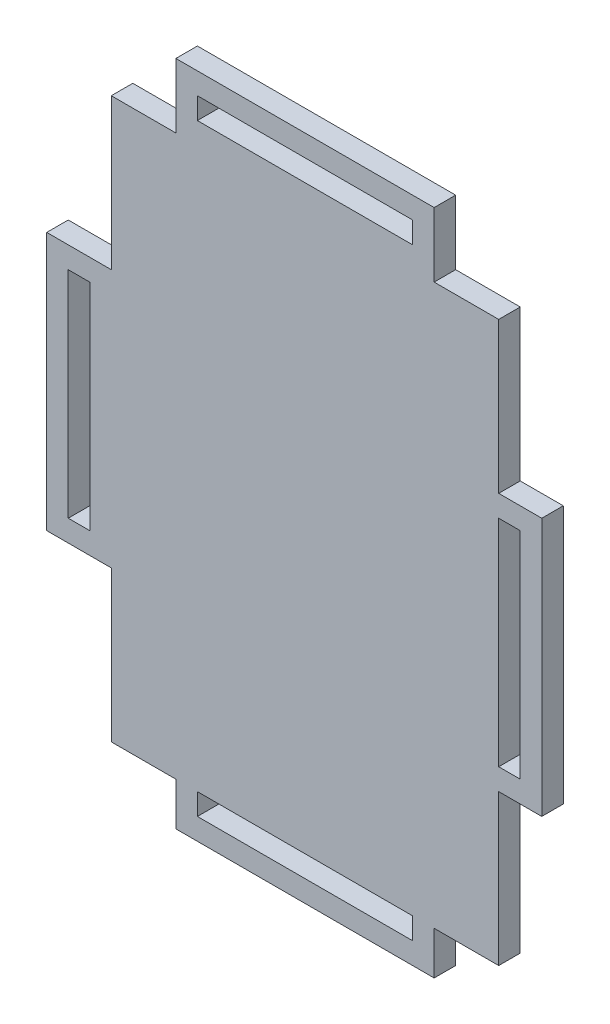
ISO-10303-21;
HEADER;
FILE_DESCRIPTION(('STEP AP214'),'2;1');
FILE_NAME('part.step','',(''),(''),'','','');
FILE_SCHEMA(('AUTOMOTIVE_DESIGN { 1 0 10303 214 1 1 1 1 }'));
ENDSEC;
DATA;
#1=APPLICATION_CONTEXT('core data for automotive mechanical design processes');
#2=APPLICATION_PROTOCOL_DEFINITION('international standard','automotive_design',2000,#1);
#3=PRODUCT_CONTEXT('',#1,'mechanical');
#4=PRODUCT('Part','Part','',(#3));
#5=PRODUCT_RELATED_PRODUCT_CATEGORY('part','',(#4));
#6=PRODUCT_DEFINITION_FORMATION('','',#4);
#7=PRODUCT_DEFINITION_CONTEXT('part definition',#1,'design');
#8=PRODUCT_DEFINITION('design','',#6,#7);
#9=PRODUCT_DEFINITION_SHAPE('','',#8);
#10=(LENGTH_UNIT() NAMED_UNIT(*) SI_UNIT(.MILLI.,.METRE.));
#11=(NAMED_UNIT(*) PLANE_ANGLE_UNIT() SI_UNIT($,.RADIAN.));
#12=(NAMED_UNIT(*) SI_UNIT($,.STERADIAN.) SOLID_ANGLE_UNIT());
#13=UNCERTAINTY_MEASURE_WITH_UNIT(LENGTH_MEASURE(1.E-05),#10,'distance_accuracy_value','');
#14=(GEOMETRIC_REPRESENTATION_CONTEXT(3) GLOBAL_UNCERTAINTY_ASSIGNED_CONTEXT((#13)) GLOBAL_UNIT_ASSIGNED_CONTEXT((#10,
#11,#12)) REPRESENTATION_CONTEXT('',''));
#15=CARTESIAN_POINT('',(0.,0.,0.));
#16=DIRECTION('',(0.,0.,1.));
#17=DIRECTION('',(1.,0.,0.));
#18=AXIS2_PLACEMENT_3D('',#15,#16,#17);
#19=CARTESIAN_POINT('',(-90.,0.,5.));
#20=DIRECTION('',(1.,0.,0.));
#21=DIRECTION('',(0.,1.,0.));
#22=AXIS2_PLACEMENT_3D('',#19,#20,#21);
#23=PLANE('',#22);
#24=DIRECTION('',(0.,0.,-1.));
#25=VECTOR('',#24,1.);
#26=CARTESIAN_POINT('',(-90.,-35.,5.));
#27=LINE('',#26,#25);
#28=CARTESIAN_POINT('',(-90.,-35.,5.));
#29=VERTEX_POINT('',#28);
#30=CARTESIAN_POINT('',(-90.,-35.,0.));
#31=VERTEX_POINT('',#30);
#32=EDGE_CURVE('E327',#29,#31,#27,.T.);
#33=ORIENTED_EDGE('',*,*,#32,.F.);
#34=DIRECTION('',(0.,-1.,0.));
#35=VECTOR('',#34,1.);
#36=CARTESIAN_POINT('',(-90.,0.,5.));
#37=LINE('',#36,#35);
#38=CARTESIAN_POINT('',(-90.,0.,5.));
#39=VERTEX_POINT('',#38);
#40=EDGE_CURVE('E505',#39,#29,#37,.T.);
#41=ORIENTED_EDGE('',*,*,#40,.F.);
#42=DIRECTION('',(0.,0.,-1.));
#43=VECTOR('',#42,1.);
#44=CARTESIAN_POINT('',(-90.,0.,5.));
#45=LINE('',#44,#43);
#46=CARTESIAN_POINT('',(-90.,0.,0.));
#47=VERTEX_POINT('',#46);
#48=EDGE_CURVE('E43',#39,#47,#45,.T.);
#49=ORIENTED_EDGE('',*,*,#48,.T.);
#50=DIRECTION('',(0.,-1.,0.));
#51=VECTOR('',#50,1.);
#52=CARTESIAN_POINT('',(-90.,0.,0.));
#53=LINE('',#52,#51);
#54=EDGE_CURVE('E522',#47,#31,#53,.T.);
#55=ORIENTED_EDGE('',*,*,#54,.T.);
#56=EDGE_LOOP('',(#33,#41,#49,#55));
#57=FACE_BOUND('',#56,.T.);
#58=ADVANCED_FACE('F35',(#57),#23,.F.);
#59=CARTESIAN_POINT('',(0.,0.,5.));
#60=DIRECTION('',(-1.,0.,0.));
#61=DIRECTION('',(0.,0.,1.));
#62=AXIS2_PLACEMENT_3D('',#59,#60,#61);
#63=PLANE('',#62);
#64=DIRECTION('',(0.,0.,1.));
#65=VECTOR('',#64,1.);
#66=CARTESIAN_POINT('',(0.,-90.,0.));
#67=LINE('',#66,#65);
#68=CARTESIAN_POINT('',(0.,-90.,0.));
#69=VERTEX_POINT('',#68);
#70=CARTESIAN_POINT('',(0.,-90.,5.));
#71=VERTEX_POINT('',#70);
#72=EDGE_CURVE('E352',#69,#71,#67,.T.);
#73=ORIENTED_EDGE('',*,*,#72,.F.);
#74=DIRECTION('',(0.,1.,0.));
#75=VECTOR('',#74,1.);
#76=CARTESIAN_POINT('',(0.,0.,0.));
#77=LINE('',#76,#75);
#78=CARTESIAN_POINT('',(0.,-40.,0.));
#79=VERTEX_POINT('',#78);
#80=EDGE_CURVE('E517',#69,#79,#77,.T.);
#81=ORIENTED_EDGE('',*,*,#80,.T.);
#82=DIRECTION('',(0.,0.,1.));
#83=VECTOR('',#82,1.);
#84=CARTESIAN_POINT('',(0.,-40.,0.));
#85=LINE('',#84,#83);
#86=CARTESIAN_POINT('',(0.,-40.,5.));
#87=VERTEX_POINT('',#86);
#88=EDGE_CURVE('E375',#79,#87,#85,.T.);
#89=ORIENTED_EDGE('',*,*,#88,.T.);
#90=DIRECTION('',(0.,1.,0.));
#91=VECTOR('',#90,1.);
#92=CARTESIAN_POINT('',(0.,0.,5.));
#93=LINE('',#92,#91);
#94=EDGE_CURVE('E500',#71,#87,#93,.T.);
#95=ORIENTED_EDGE('',*,*,#94,.F.);
#96=EDGE_LOOP('',(#73,#81,#89,#95));
#97=FACE_BOUND('',#96,.T.);
#98=ADVANCED_FACE('F588',(#97),#63,.F.);
#99=DIRECTION('',(0.,0.,1.));
#100=VECTOR('',#99,1.);
#101=CARTESIAN_POINT('',(0.,-35.,0.));
#102=LINE('',#101,#100);
#103=CARTESIAN_POINT('',(0.,-35.,0.));
#104=VERTEX_POINT('',#103);
#105=CARTESIAN_POINT('',(0.,-35.,5.));
#106=VERTEX_POINT('',#105);
#107=EDGE_CURVE('E377',#104,#106,#102,.T.);
#108=ORIENTED_EDGE('',*,*,#107,.F.);
#109=CARTESIAN_POINT('',(0.,0.,0.));
#110=VERTEX_POINT('',#109);
#111=EDGE_CURVE('E479',#104,#110,#77,.T.);
#112=ORIENTED_EDGE('',*,*,#111,.T.);
#113=DIRECTION('',(0.,0.,-1.));
#114=VECTOR('',#113,1.);
#115=CARTESIAN_POINT('',(0.,0.,5.));
#116=LINE('',#115,#114);
#117=CARTESIAN_POINT('',(0.,0.,5.));
#118=VERTEX_POINT('',#117);
#119=EDGE_CURVE('E12',#118,#110,#116,.T.);
#120=ORIENTED_EDGE('',*,*,#119,.F.);
#121=EDGE_CURVE('E58',#106,#118,#93,.T.);
#122=ORIENTED_EDGE('',*,*,#121,.F.);
#123=EDGE_LOOP('',(#108,#112,#120,#122));
#124=FACE_BOUND('',#123,.T.);
#125=ADVANCED_FACE('F589',(#124),#63,.F.);
#126=CARTESIAN_POINT('',(0.,-130.,5.));
#127=DIRECTION('',(0.,1.,0.));
#128=DIRECTION('',(0.,0.,1.));
#129=AXIS2_PLACEMENT_3D('',#126,#127,#128);
#130=PLANE('',#129);
#131=DIRECTION('',(0.,0.,1.));
#132=VECTOR('',#131,1.);
#133=CARTESIAN_POINT('',(-70.,-130.,0.));
#134=LINE('',#133,#132);
#135=CARTESIAN_POINT('',(-70.,-130.,0.));
#136=VERTEX_POINT('',#135);
#137=CARTESIAN_POINT('',(-70.,-130.,5.));
#138=VERTEX_POINT('',#137);
#139=EDGE_CURVE('E404',#136,#138,#134,.T.);
#140=ORIENTED_EDGE('',*,*,#139,.F.);
#141=DIRECTION('',(1.,0.,0.));
#142=VECTOR('',#141,1.);
#143=CARTESIAN_POINT('',(0.,-130.,0.));
#144=LINE('',#143,#142);
#145=CARTESIAN_POINT('',(-20.,-130.,0.));
#146=VERTEX_POINT('',#145);
#147=EDGE_CURVE('E528',#136,#146,#144,.T.);
#148=ORIENTED_EDGE('',*,*,#147,.T.);
#149=DIRECTION('',(0.,0.,1.));
#150=VECTOR('',#149,1.);
#151=CARTESIAN_POINT('',(-20.,-130.,0.));
#152=LINE('',#151,#150);
#153=CARTESIAN_POINT('',(-20.,-130.,5.));
#154=VERTEX_POINT('',#153);
#155=EDGE_CURVE('E427',#146,#154,#152,.T.);
#156=ORIENTED_EDGE('',*,*,#155,.T.);
#157=DIRECTION('',(1.,0.,0.));
#158=VECTOR('',#157,1.);
#159=CARTESIAN_POINT('',(0.,-130.,5.));
#160=LINE('',#159,#158);
#161=EDGE_CURVE('E513',#138,#154,#160,.T.);
#162=ORIENTED_EDGE('',*,*,#161,.F.);
#163=EDGE_LOOP('',(#140,#148,#156,#162));
#164=FACE_BOUND('',#163,.T.);
#165=ADVANCED_FACE('F614',(#164),#130,.F.);
#166=DIRECTION('',(0.,0.,1.));
#167=VECTOR('',#166,1.);
#168=CARTESIAN_POINT('',(-15.,-130.,0.));
#169=LINE('',#168,#167);
#170=CARTESIAN_POINT('',(-15.,-130.,0.));
#171=VERTEX_POINT('',#170);
#172=CARTESIAN_POINT('',(-15.,-130.,5.));
#173=VERTEX_POINT('',#172);
#174=EDGE_CURVE('E429',#171,#173,#169,.T.);
#175=ORIENTED_EDGE('',*,*,#174,.F.);
#176=CARTESIAN_POINT('',(0.,-130.,0.));
#177=VERTEX_POINT('',#176);
#178=EDGE_CURVE('E525',#171,#177,#144,.T.);
#179=ORIENTED_EDGE('',*,*,#178,.T.);
#180=DIRECTION('',(0.,0.,-1.));
#181=VECTOR('',#180,1.);
#182=CARTESIAN_POINT('',(0.,-130.,5.));
#183=LINE('',#182,#181);
#184=CARTESIAN_POINT('',(0.,-130.,5.));
#185=VERTEX_POINT('',#184);
#186=EDGE_CURVE('E512',#185,#177,#183,.T.);
#187=ORIENTED_EDGE('',*,*,#186,.F.);
#188=EDGE_CURVE('E508',#173,#185,#160,.T.);
#189=ORIENTED_EDGE('',*,*,#188,.F.);
#190=EDGE_LOOP('',(#175,#179,#187,#189));
#191=FACE_BOUND('',#190,.T.);
#192=ADVANCED_FACE('F609',(#191),#130,.F.);
#193=CARTESIAN_POINT('',(0.,0.,5.));
#194=DIRECTION('',(0.,-1.,0.));
#195=DIRECTION('',(1.,0.,0.));
#196=AXIS2_PLACEMENT_3D('',#193,#194,#195);
#197=PLANE('',#196);
#198=DIRECTION('',(0.,0.,1.));
#199=VECTOR('',#198,1.);
#200=CARTESIAN_POINT('',(-75.,0.,0.));
#201=LINE('',#200,#199);
#202=CARTESIAN_POINT('',(-75.,0.,0.));
#203=VERTEX_POINT('',#202);
#204=CARTESIAN_POINT('',(-75.,0.,5.));
#205=VERTEX_POINT('',#204);
#206=EDGE_CURVE('E476',#203,#205,#201,.T.);
#207=ORIENTED_EDGE('',*,*,#206,.F.);
#208=DIRECTION('',(-1.,0.,0.));
#209=VECTOR('',#208,1.);
#210=CARTESIAN_POINT('',(0.,0.,0.));
#211=LINE('',#210,#209);
#212=EDGE_CURVE('E516',#203,#47,#211,.T.);
#213=ORIENTED_EDGE('',*,*,#212,.T.);
#214=ORIENTED_EDGE('',*,*,#48,.F.);
#215=DIRECTION('',(-1.,0.,0.));
#216=VECTOR('',#215,1.);
#217=CARTESIAN_POINT('',(0.,0.,5.));
#218=LINE('',#217,#216);
#219=EDGE_CURVE('E499',#205,#39,#218,.T.);
#220=ORIENTED_EDGE('',*,*,#219,.F.);
#221=EDGE_LOOP('',(#207,#213,#214,#220));
#222=FACE_BOUND('',#221,.T.);
#223=ADVANCED_FACE('F556',(#222),#197,.F.);
#224=CARTESIAN_POINT('',(0.,-95.,0.));
#225=VERTEX_POINT('',#224);
#226=EDGE_CURVE('E514',#177,#225,#77,.T.);
#227=ORIENTED_EDGE('',*,*,#226,.T.);
#228=DIRECTION('',(0.,0.,1.));
#229=VECTOR('',#228,1.);
#230=CARTESIAN_POINT('',(0.,-95.,0.));
#231=LINE('',#230,#229);
#232=CARTESIAN_POINT('',(0.,-95.,5.));
#233=VERTEX_POINT('',#232);
#234=EDGE_CURVE('E383',#225,#233,#231,.T.);
#235=ORIENTED_EDGE('',*,*,#234,.T.);
#236=EDGE_CURVE('E496',#185,#233,#93,.T.);
#237=ORIENTED_EDGE('',*,*,#236,.F.);
#238=ORIENTED_EDGE('',*,*,#186,.T.);
#239=EDGE_LOOP('',(#227,#235,#237,#238));
#240=FACE_BOUND('',#239,.T.);
#241=ADVANCED_FACE('F37',(#240),#63,.F.);
#242=CARTESIAN_POINT('',(-15.,0.,0.));
#243=VERTEX_POINT('',#242);
#244=EDGE_CURVE('E518',#110,#243,#211,.T.);
#245=ORIENTED_EDGE('',*,*,#244,.T.);
#246=DIRECTION('',(0.,0.,1.));
#247=VECTOR('',#246,1.);
#248=CARTESIAN_POINT('',(-15.,0.,0.));
#249=LINE('',#248,#247);
#250=CARTESIAN_POINT('',(-15.,0.,5.));
#251=VERTEX_POINT('',#250);
#252=EDGE_CURVE('E485',#243,#251,#249,.T.);
#253=ORIENTED_EDGE('',*,*,#252,.T.);
#254=EDGE_CURVE('E501',#118,#251,#218,.T.);
#255=ORIENTED_EDGE('',*,*,#254,.F.);
#256=ORIENTED_EDGE('',*,*,#119,.T.);
#257=EDGE_LOOP('',(#245,#253,#255,#256));
#258=FACE_BOUND('',#257,.T.);
#259=ADVANCED_FACE('F570',(#258),#197,.F.);
#260=CARTESIAN_POINT('',(-90.,-95.,5.));
#261=VERTEX_POINT('',#260);
#262=CARTESIAN_POINT('',(-90.,-130.,5.));
#263=VERTEX_POINT('',#262);
#264=EDGE_CURVE('E504',#261,#263,#37,.T.);
#265=ORIENTED_EDGE('',*,*,#264,.F.);
#266=DIRECTION('',(0.,0.,-1.));
#267=VECTOR('',#266,1.);
#268=CARTESIAN_POINT('',(-90.,-95.,5.));
#269=LINE('',#268,#267);
#270=CARTESIAN_POINT('',(-90.,-95.,0.));
#271=VERTEX_POINT('',#270);
#272=EDGE_CURVE('E320',#261,#271,#269,.T.);
#273=ORIENTED_EDGE('',*,*,#272,.T.);
#274=CARTESIAN_POINT('',(-90.,-130.,0.));
#275=VERTEX_POINT('',#274);
#276=EDGE_CURVE('E521',#271,#275,#53,.T.);
#277=ORIENTED_EDGE('',*,*,#276,.T.);
#278=DIRECTION('',(0.,0.,-1.));
#279=VECTOR('',#278,1.);
#280=CARTESIAN_POINT('',(-90.,-130.,5.));
#281=LINE('',#280,#279);
#282=EDGE_CURVE('E531',#263,#275,#281,.T.);
#283=ORIENTED_EDGE('',*,*,#282,.F.);
#284=EDGE_LOOP('',(#265,#273,#277,#283));
#285=FACE_BOUND('',#284,.T.);
#286=ADVANCED_FACE('F649',(#285),#23,.F.);
#287=CARTESIAN_POINT('',(-75.,-130.,0.));
#288=VERTEX_POINT('',#287);
#289=EDGE_CURVE('E526',#275,#288,#144,.T.);
#290=ORIENTED_EDGE('',*,*,#289,.T.);
#291=DIRECTION('',(0.,0.,1.));
#292=VECTOR('',#291,1.);
#293=CARTESIAN_POINT('',(-75.,-130.,0.));
#294=LINE('',#293,#292);
#295=CARTESIAN_POINT('',(-75.,-130.,5.));
#296=VERTEX_POINT('',#295);
#297=EDGE_CURVE('E436',#288,#296,#294,.T.);
#298=ORIENTED_EDGE('',*,*,#297,.T.);
#299=EDGE_CURVE('E509',#263,#296,#160,.T.);
#300=ORIENTED_EDGE('',*,*,#299,.F.);
#301=ORIENTED_EDGE('',*,*,#282,.T.);
#302=EDGE_LOOP('',(#290,#298,#300,#301));
#303=FACE_BOUND('',#302,.T.);
#304=ADVANCED_FACE('F644',(#303),#130,.F.);
#305=CARTESIAN_POINT('',(0.,0.,5.));
#306=DIRECTION('',(0.,0.,-1.));
#307=DIRECTION('',(-1.,0.,0.));
#308=AXIS2_PLACEMENT_3D('',#305,#306,#307);
#309=PLANE('',#308);
#310=DIRECTION('',(1.,0.,0.));
#311=VECTOR('',#310,1.);
#312=CARTESIAN_POINT('',(0.,-35.,5.));
#313=LINE('',#312,#311);
#314=CARTESIAN_POINT('',(10.,-35.,5.));
#315=VERTEX_POINT('',#314);
#316=EDGE_CURVE('E361',#106,#315,#313,.T.);
#317=ORIENTED_EDGE('',*,*,#316,.F.);
#318=ORIENTED_EDGE('',*,*,#121,.T.);
#319=ORIENTED_EDGE('',*,*,#254,.T.);
#320=DIRECTION('',(0.,1.,0.));
#321=VECTOR('',#320,1.);
#322=CARTESIAN_POINT('',(-15.,0.,5.));
#323=LINE('',#322,#321);
#324=CARTESIAN_POINT('',(-15.,15.,5.));
#325=VERTEX_POINT('',#324);
#326=EDGE_CURVE('E469',#251,#325,#323,.T.);
#327=ORIENTED_EDGE('',*,*,#326,.T.);
#328=DIRECTION('',(1.,0.,0.));
#329=VECTOR('',#328,1.);
#330=CARTESIAN_POINT('',(0.,15.,5.));
#331=LINE('',#330,#329);
#332=CARTESIAN_POINT('',(-75.,15.,5.));
#333=VERTEX_POINT('',#332);
#334=EDGE_CURVE('E472',#333,#325,#331,.T.);
#335=ORIENTED_EDGE('',*,*,#334,.F.);
#336=DIRECTION('',(0.,1.,0.));
#337=VECTOR('',#336,1.);
#338=CARTESIAN_POINT('',(-75.,0.,5.));
#339=LINE('',#338,#337);
#340=EDGE_CURVE('E443',#205,#333,#339,.T.);
#341=ORIENTED_EDGE('',*,*,#340,.F.);
#342=ORIENTED_EDGE('',*,*,#219,.T.);
#343=ORIENTED_EDGE('',*,*,#40,.T.);
#344=DIRECTION('',(1.,0.,0.));
#345=VECTOR('',#344,1.);
#346=CARTESIAN_POINT('',(-90.,-35.,5.));
#347=LINE('',#346,#345);
#348=CARTESIAN_POINT('',(-105.,-35.,5.));
#349=VERTEX_POINT('',#348);
#350=EDGE_CURVE('E318',#349,#29,#347,.T.);
#351=ORIENTED_EDGE('',*,*,#350,.F.);
#352=DIRECTION('',(0.,1.,0.));
#353=VECTOR('',#352,1.);
#354=CARTESIAN_POINT('',(-105.,-35.,5.));
#355=LINE('',#354,#353);
#356=CARTESIAN_POINT('',(-105.,-95.,5.));
#357=VERTEX_POINT('',#356);
#358=EDGE_CURVE('E314',#357,#349,#355,.T.);
#359=ORIENTED_EDGE('',*,*,#358,.F.);
#360=DIRECTION('',(-1.,0.,0.));
#361=VECTOR('',#360,1.);
#362=CARTESIAN_POINT('',(-90.,-95.,5.));
#363=LINE('',#362,#361);
#364=EDGE_CURVE('E311',#261,#357,#363,.T.);
#365=ORIENTED_EDGE('',*,*,#364,.F.);
#366=ORIENTED_EDGE('',*,*,#264,.T.);
#367=ORIENTED_EDGE('',*,*,#299,.T.);
#368=DIRECTION('',(0.,-1.,0.));
#369=VECTOR('',#368,1.);
#370=CARTESIAN_POINT('',(-75.,0.,5.));
#371=LINE('',#370,#369);
#372=CARTESIAN_POINT('',(-75.,-140.,5.));
#373=VERTEX_POINT('',#372);
#374=EDGE_CURVE('E407',#296,#373,#371,.T.);
#375=ORIENTED_EDGE('',*,*,#374,.T.);
#376=DIRECTION('',(1.,0.,0.));
#377=VECTOR('',#376,1.);
#378=CARTESIAN_POINT('',(0.,-140.,5.));
#379=LINE('',#378,#377);
#380=CARTESIAN_POINT('',(-15.,-140.,5.));
#381=VERTEX_POINT('',#380);
#382=EDGE_CURVE('E410',#373,#381,#379,.T.);
#383=ORIENTED_EDGE('',*,*,#382,.T.);
#384=DIRECTION('',(0.,-1.,0.));
#385=VECTOR('',#384,1.);
#386=CARTESIAN_POINT('',(-15.,0.,5.));
#387=LINE('',#386,#385);
#388=EDGE_CURVE('E413',#173,#381,#387,.T.);
#389=ORIENTED_EDGE('',*,*,#388,.F.);
#390=ORIENTED_EDGE('',*,*,#188,.T.);
#391=ORIENTED_EDGE('',*,*,#236,.T.);
#392=DIRECTION('',(1.,0.,0.));
#393=VECTOR('',#392,1.);
#394=CARTESIAN_POINT('',(0.,-95.,5.));
#395=LINE('',#394,#393);
#396=CARTESIAN_POINT('',(10.,-95.,5.));
#397=VERTEX_POINT('',#396);
#398=EDGE_CURVE('E355',#233,#397,#395,.T.);
#399=ORIENTED_EDGE('',*,*,#398,.T.);
#400=DIRECTION('',(0.,1.,0.));
#401=VECTOR('',#400,1.);
#402=CARTESIAN_POINT('',(10.0000000000001,0.,5.));
#403=LINE('',#402,#401);
#404=EDGE_CURVE('E358',#397,#315,#403,.T.);
#405=ORIENTED_EDGE('',*,*,#404,.T.);
#406=EDGE_LOOP('',(#317,#318,#319,#327,#335,#341,#342,#343,#351,#359,#365,#366,#367,#375,#383,
#389,#390,#391,#399,#405));
#407=FACE_BOUND('',#406,.T.);
#408=ORIENTED_EDGE('',*,*,#94,.T.);
#409=DIRECTION('',(1.,0.,0.));
#410=VECTOR('',#409,1.);
#411=CARTESIAN_POINT('',(0.,-40.,5.));
#412=LINE('',#411,#410);
#413=CARTESIAN_POINT('',(5.00000000000003,-40.,5.));
#414=VERTEX_POINT('',#413);
#415=EDGE_CURVE('E364',#87,#414,#412,.T.);
#416=ORIENTED_EDGE('',*,*,#415,.T.);
#417=DIRECTION('',(0.,1.,0.));
#418=VECTOR('',#417,1.);
#419=CARTESIAN_POINT('',(5.00000000000003,0.,5.));
#420=LINE('',#419,#418);
#421=CARTESIAN_POINT('',(5.00000000000003,-90.,5.));
#422=VERTEX_POINT('',#421);
#423=EDGE_CURVE('E339',#422,#414,#420,.T.);
#424=ORIENTED_EDGE('',*,*,#423,.F.);
#425=DIRECTION('',(1.,0.,0.));
#426=VECTOR('',#425,1.);
#427=CARTESIAN_POINT('',(0.,-90.,5.));
#428=LINE('',#427,#426);
#429=EDGE_CURVE('E329',#71,#422,#428,.T.);
#430=ORIENTED_EDGE('',*,*,#429,.F.);
#431=EDGE_LOOP('',(#408,#416,#424,#430));
#432=FACE_BOUND('',#431,.T.);
#433=ORIENTED_EDGE('',*,*,#161,.T.);
#434=DIRECTION('',(0.,-1.,0.));
#435=VECTOR('',#434,1.);
#436=CARTESIAN_POINT('',(-20.,0.,5.));
#437=LINE('',#436,#435);
#438=CARTESIAN_POINT('',(-20.,-135.,5.));
#439=VERTEX_POINT('',#438);
#440=EDGE_CURVE('E416',#154,#439,#437,.T.);
#441=ORIENTED_EDGE('',*,*,#440,.T.);
#442=DIRECTION('',(1.,0.,0.));
#443=VECTOR('',#442,1.);
#444=CARTESIAN_POINT('',(0.,-135.,5.));
#445=LINE('',#444,#443);
#446=CARTESIAN_POINT('',(-70.,-135.,5.));
#447=VERTEX_POINT('',#446);
#448=EDGE_CURVE('E391',#447,#439,#445,.T.);
#449=ORIENTED_EDGE('',*,*,#448,.F.);
#450=DIRECTION('',(0.,-1.,0.));
#451=VECTOR('',#450,1.);
#452=CARTESIAN_POINT('',(-69.9999999999996,1.94289029309401E-13,5.));
#453=LINE('',#452,#451);
#454=EDGE_CURVE('E372',#138,#447,#453,.T.);
#455=ORIENTED_EDGE('',*,*,#454,.F.);
#456=EDGE_LOOP('',(#433,#441,#449,#455));
#457=FACE_BOUND('',#456,.T.);
#458=DIRECTION('',(0.,1.,0.));
#459=VECTOR('',#458,1.);
#460=CARTESIAN_POINT('',(-20.,0.,5.));
#461=LINE('',#460,#459);
#462=CARTESIAN_POINT('',(-20.,5.,5.));
#463=VERTEX_POINT('',#462);
#464=CARTESIAN_POINT('',(-20.,10.,5.));
#465=VERTEX_POINT('',#464);
#466=EDGE_CURVE('E424',#463,#465,#461,.T.);
#467=ORIENTED_EDGE('',*,*,#466,.F.);
#468=DIRECTION('',(1.,0.,0.));
#469=VECTOR('',#468,1.);
#470=CARTESIAN_POINT('',(0.,5.,5.));
#471=LINE('',#470,#469);
#472=CARTESIAN_POINT('',(-70.,5.,5.));
#473=VERTEX_POINT('',#472);
#474=EDGE_CURVE('E461',#473,#463,#471,.T.);
#475=ORIENTED_EDGE('',*,*,#474,.F.);
#476=DIRECTION('',(0.,1.,0.));
#477=VECTOR('',#476,1.);
#478=CARTESIAN_POINT('',(-70.,0.,5.));
#479=LINE('',#478,#477);
#480=CARTESIAN_POINT('',(-70.,10.,5.));
#481=VERTEX_POINT('',#480);
#482=EDGE_CURVE('E463',#473,#481,#479,.T.);
#483=ORIENTED_EDGE('',*,*,#482,.T.);
#484=DIRECTION('',(1.,0.,0.));
#485=VECTOR('',#484,1.);
#486=CARTESIAN_POINT('',(0.,10.,5.));
#487=LINE('',#486,#485);
#488=EDGE_CURVE('E466',#481,#465,#487,.T.);
#489=ORIENTED_EDGE('',*,*,#488,.T.);
#490=EDGE_LOOP('',(#467,#475,#483,#489));
#491=FACE_BOUND('',#490,.T.);
#492=DIRECTION('',(1.,0.,0.));
#493=VECTOR('',#492,1.);
#494=CARTESIAN_POINT('',(-95.,-40.,5.));
#495=LINE('',#494,#493);
#496=CARTESIAN_POINT('',(-100.,-40.,5.));
#497=VERTEX_POINT('',#496);
#498=CARTESIAN_POINT('',(-95.,-40.,5.));
#499=VERTEX_POINT('',#498);
#500=EDGE_CURVE('E281',#497,#499,#495,.T.);
#501=ORIENTED_EDGE('',*,*,#500,.T.);
#502=DIRECTION('',(0.,-1.,0.));
#503=VECTOR('',#502,1.);
#504=CARTESIAN_POINT('',(-95.,-40.,5.));
#505=LINE('',#504,#503);
#506=CARTESIAN_POINT('',(-95.,-90.,5.));
#507=VERTEX_POINT('',#506);
#508=EDGE_CURVE('E273',#499,#507,#505,.T.);
#509=ORIENTED_EDGE('',*,*,#508,.T.);
#510=DIRECTION('',(-1.,0.,0.));
#511=VECTOR('',#510,1.);
#512=CARTESIAN_POINT('',(-95.,-90.,5.));
#513=LINE('',#512,#511);
#514=CARTESIAN_POINT('',(-100.,-90.,5.));
#515=VERTEX_POINT('',#514);
#516=EDGE_CURVE('E285',#507,#515,#513,.T.);
#517=ORIENTED_EDGE('',*,*,#516,.T.);
#518=DIRECTION('',(0.,1.,0.));
#519=VECTOR('',#518,1.);
#520=CARTESIAN_POINT('',(-100.,-40.,5.));
#521=LINE('',#520,#519);
#522=EDGE_CURVE('E289',#515,#497,#521,.T.);
#523=ORIENTED_EDGE('',*,*,#522,.T.);
#524=EDGE_LOOP('',(#501,#509,#517,#523));
#525=FACE_BOUND('',#524,.T.);
#526=ADVANCED_FACE('F291',(#407,#432,#457,#491,#525),#309,.F.);
#527=CARTESIAN_POINT('',(0.,0.,0.));
#528=DIRECTION('',(0.,0.,-1.));
#529=DIRECTION('',(-1.,0.,0.));
#530=AXIS2_PLACEMENT_3D('',#527,#528,#529);
#531=PLANE('',#530);
#532=ORIENTED_EDGE('',*,*,#111,.F.);
#533=DIRECTION('',(1.,0.,0.));
#534=VECTOR('',#533,1.);
#535=CARTESIAN_POINT('',(0.,-35.,0.));
#536=LINE('',#535,#534);
#537=CARTESIAN_POINT('',(10.,-35.,0.));
#538=VERTEX_POINT('',#537);
#539=EDGE_CURVE('E345',#104,#538,#536,.T.);
#540=ORIENTED_EDGE('',*,*,#539,.T.);
#541=DIRECTION('',(0.,1.,0.));
#542=VECTOR('',#541,1.);
#543=CARTESIAN_POINT('',(10.0000000000001,0.,0.));
#544=LINE('',#543,#542);
#545=CARTESIAN_POINT('',(10.,-95.,0.));
#546=VERTEX_POINT('',#545);
#547=EDGE_CURVE('E342',#546,#538,#544,.T.);
#548=ORIENTED_EDGE('',*,*,#547,.F.);
#549=DIRECTION('',(1.,0.,0.));
#550=VECTOR('',#549,1.);
#551=CARTESIAN_POINT('',(0.,-95.,0.));
#552=LINE('',#551,#550);
#553=EDGE_CURVE('E338',#225,#546,#552,.T.);
#554=ORIENTED_EDGE('',*,*,#553,.F.);
#555=ORIENTED_EDGE('',*,*,#226,.F.);
#556=ORIENTED_EDGE('',*,*,#178,.F.);
#557=DIRECTION('',(0.,-1.,0.));
#558=VECTOR('',#557,1.);
#559=CARTESIAN_POINT('',(-15.,0.,0.));
#560=LINE('',#559,#558);
#561=CARTESIAN_POINT('',(-15.,-140.,0.));
#562=VERTEX_POINT('',#561);
#563=EDGE_CURVE('E397',#171,#562,#560,.T.);
#564=ORIENTED_EDGE('',*,*,#563,.T.);
#565=DIRECTION('',(1.,0.,0.));
#566=VECTOR('',#565,1.);
#567=CARTESIAN_POINT('',(0.,-140.,0.));
#568=LINE('',#567,#566);
#569=CARTESIAN_POINT('',(-75.,-140.,0.));
#570=VERTEX_POINT('',#569);
#571=EDGE_CURVE('E394',#570,#562,#568,.T.);
#572=ORIENTED_EDGE('',*,*,#571,.F.);
#573=DIRECTION('',(0.,-1.,0.));
#574=VECTOR('',#573,1.);
#575=CARTESIAN_POINT('',(-75.,0.,0.));
#576=LINE('',#575,#574);
#577=EDGE_CURVE('E390',#288,#570,#576,.T.);
#578=ORIENTED_EDGE('',*,*,#577,.F.);
#579=ORIENTED_EDGE('',*,*,#289,.F.);
#580=ORIENTED_EDGE('',*,*,#276,.F.);
#581=DIRECTION('',(-1.,0.,0.));
#582=VECTOR('',#581,1.);
#583=CARTESIAN_POINT('',(-90.,-95.,0.));
#584=LINE('',#583,#582);
#585=CARTESIAN_POINT('',(-105.,-95.,0.));
#586=VERTEX_POINT('',#585);
#587=EDGE_CURVE('E50',#271,#586,#584,.T.);
#588=ORIENTED_EDGE('',*,*,#587,.T.);
#589=DIRECTION('',(0.,1.,0.));
#590=VECTOR('',#589,1.);
#591=CARTESIAN_POINT('',(-105.,-35.,0.));
#592=LINE('',#591,#590);
#593=CARTESIAN_POINT('',(-105.,-35.,0.));
#594=VERTEX_POINT('',#593);
#595=EDGE_CURVE('E322',#586,#594,#592,.T.);
#596=ORIENTED_EDGE('',*,*,#595,.T.);
#597=DIRECTION('',(1.,0.,0.));
#598=VECTOR('',#597,1.);
#599=CARTESIAN_POINT('',(-90.,-35.,0.));
#600=LINE('',#599,#598);
#601=EDGE_CURVE('E315',#594,#31,#600,.T.);
#602=ORIENTED_EDGE('',*,*,#601,.T.);
#603=ORIENTED_EDGE('',*,*,#54,.F.);
#604=ORIENTED_EDGE('',*,*,#212,.F.);
#605=DIRECTION('',(0.,1.,0.));
#606=VECTOR('',#605,1.);
#607=CARTESIAN_POINT('',(-75.,0.,0.));
#608=LINE('',#607,#606);
#609=CARTESIAN_POINT('',(-75.,15.,0.));
#610=VERTEX_POINT('',#609);
#611=EDGE_CURVE('E456',#203,#610,#608,.T.);
#612=ORIENTED_EDGE('',*,*,#611,.T.);
#613=DIRECTION('',(1.,0.,0.));
#614=VECTOR('',#613,1.);
#615=CARTESIAN_POINT('',(0.,15.,0.));
#616=LINE('',#615,#614);
#617=CARTESIAN_POINT('',(-15.,15.,0.));
#618=VERTEX_POINT('',#617);
#619=EDGE_CURVE('E454',#610,#618,#616,.T.);
#620=ORIENTED_EDGE('',*,*,#619,.T.);
#621=DIRECTION('',(0.,1.,0.));
#622=VECTOR('',#621,1.);
#623=CARTESIAN_POINT('',(-15.,0.,0.));
#624=LINE('',#623,#622);
#625=EDGE_CURVE('E451',#243,#618,#624,.T.);
#626=ORIENTED_EDGE('',*,*,#625,.F.);
#627=ORIENTED_EDGE('',*,*,#244,.F.);
#628=EDGE_LOOP('',(#532,#540,#548,#554,#555,#556,#564,#572,#578,#579,#580,#588,#596,#602,#603,
#604,#612,#620,#626,#627));
#629=FACE_BOUND('',#628,.T.);
#630=DIRECTION('',(1.,0.,0.));
#631=VECTOR('',#630,1.);
#632=CARTESIAN_POINT('',(0.,-40.,0.));
#633=LINE('',#632,#631);
#634=CARTESIAN_POINT('',(5.00000000000003,-40.,0.));
#635=VERTEX_POINT('',#634);
#636=EDGE_CURVE('E347',#79,#635,#633,.T.);
#637=ORIENTED_EDGE('',*,*,#636,.F.);
#638=ORIENTED_EDGE('',*,*,#80,.F.);
#639=DIRECTION('',(1.,0.,0.));
#640=VECTOR('',#639,1.);
#641=CARTESIAN_POINT('',(0.,-90.,0.));
#642=LINE('',#641,#640);
#643=CARTESIAN_POINT('',(5.00000000000003,-90.,0.));
#644=VERTEX_POINT('',#643);
#645=EDGE_CURVE('E335',#69,#644,#642,.T.);
#646=ORIENTED_EDGE('',*,*,#645,.T.);
#647=DIRECTION('',(0.,1.,0.));
#648=VECTOR('',#647,1.);
#649=CARTESIAN_POINT('',(5.00000000000003,0.,0.));
#650=LINE('',#649,#648);
#651=EDGE_CURVE('E350',#644,#635,#650,.T.);
#652=ORIENTED_EDGE('',*,*,#651,.T.);
#653=EDGE_LOOP('',(#637,#638,#646,#652));
#654=FACE_BOUND('',#653,.T.);
#655=DIRECTION('',(0.,-1.,0.));
#656=VECTOR('',#655,1.);
#657=CARTESIAN_POINT('',(-20.,0.,0.));
#658=LINE('',#657,#656);
#659=CARTESIAN_POINT('',(-20.,-135.,0.));
#660=VERTEX_POINT('',#659);
#661=EDGE_CURVE('E399',#146,#660,#658,.T.);
#662=ORIENTED_EDGE('',*,*,#661,.F.);
#663=ORIENTED_EDGE('',*,*,#147,.F.);
#664=DIRECTION('',(0.,-1.,0.));
#665=VECTOR('',#664,1.);
#666=CARTESIAN_POINT('',(-69.9999999999996,1.94289029309401E-13,0.));
#667=LINE('',#666,#665);
#668=CARTESIAN_POINT('',(-70.,-135.,0.));
#669=VERTEX_POINT('',#668);
#670=EDGE_CURVE('E387',#136,#669,#667,.T.);
#671=ORIENTED_EDGE('',*,*,#670,.T.);
#672=DIRECTION('',(1.,0.,0.));
#673=VECTOR('',#672,1.);
#674=CARTESIAN_POINT('',(0.,-135.,0.));
#675=LINE('',#674,#673);
#676=EDGE_CURVE('E402',#669,#660,#675,.T.);
#677=ORIENTED_EDGE('',*,*,#676,.T.);
#678=EDGE_LOOP('',(#662,#663,#671,#677));
#679=FACE_BOUND('',#678,.T.);
#680=DIRECTION('',(0.,1.,0.));
#681=VECTOR('',#680,1.);
#682=CARTESIAN_POINT('',(-20.,0.,0.));
#683=LINE('',#682,#681);
#684=CARTESIAN_POINT('',(-20.,5.,0.));
#685=VERTEX_POINT('',#684);
#686=CARTESIAN_POINT('',(-20.,10.,0.));
#687=VERTEX_POINT('',#686);
#688=EDGE_CURVE('E440',#685,#687,#683,.T.);
#689=ORIENTED_EDGE('',*,*,#688,.T.);
#690=DIRECTION('',(1.,0.,0.));
#691=VECTOR('',#690,1.);
#692=CARTESIAN_POINT('',(0.,10.,0.));
#693=LINE('',#692,#691);
#694=CARTESIAN_POINT('',(-70.,10.,0.));
#695=VERTEX_POINT('',#694);
#696=EDGE_CURVE('E448',#695,#687,#693,.T.);
#697=ORIENTED_EDGE('',*,*,#696,.F.);
#698=DIRECTION('',(0.,1.,0.));
#699=VECTOR('',#698,1.);
#700=CARTESIAN_POINT('',(-70.,0.,0.));
#701=LINE('',#700,#699);
#702=CARTESIAN_POINT('',(-70.,5.,0.));
#703=VERTEX_POINT('',#702);
#704=EDGE_CURVE('E445',#703,#695,#701,.T.);
#705=ORIENTED_EDGE('',*,*,#704,.F.);
#706=DIRECTION('',(1.,0.,0.));
#707=VECTOR('',#706,1.);
#708=CARTESIAN_POINT('',(0.,5.,0.));
#709=LINE('',#708,#707);
#710=EDGE_CURVE('E442',#703,#685,#709,.T.);
#711=ORIENTED_EDGE('',*,*,#710,.T.);
#712=EDGE_LOOP('',(#689,#697,#705,#711));
#713=FACE_BOUND('',#712,.T.);
#714=DIRECTION('',(0.,-1.,0.));
#715=VECTOR('',#714,1.);
#716=CARTESIAN_POINT('',(-95.,-40.,0.));
#717=LINE('',#716,#715);
#718=CARTESIAN_POINT('',(-95.,-40.,0.));
#719=VERTEX_POINT('',#718);
#720=CARTESIAN_POINT('',(-95.,-90.,0.));
#721=VERTEX_POINT('',#720);
#722=EDGE_CURVE('E276',#719,#721,#717,.T.);
#723=ORIENTED_EDGE('',*,*,#722,.F.);
#724=DIRECTION('',(1.,0.,0.));
#725=VECTOR('',#724,1.);
#726=CARTESIAN_POINT('',(-95.,-40.,0.));
#727=LINE('',#726,#725);
#728=CARTESIAN_POINT('',(-100.,-40.,0.));
#729=VERTEX_POINT('',#728);
#730=EDGE_CURVE('E293',#729,#719,#727,.T.);
#731=ORIENTED_EDGE('',*,*,#730,.F.);
#732=DIRECTION('',(0.,1.,0.));
#733=VECTOR('',#732,1.);
#734=CARTESIAN_POINT('',(-100.,-40.,0.));
#735=LINE('',#734,#733);
#736=CARTESIAN_POINT('',(-100.,-90.,0.));
#737=VERTEX_POINT('',#736);
#738=EDGE_CURVE('E296',#737,#729,#735,.T.);
#739=ORIENTED_EDGE('',*,*,#738,.F.);
#740=DIRECTION('',(-1.,0.,0.));
#741=VECTOR('',#740,1.);
#742=CARTESIAN_POINT('',(-95.,-90.,0.));
#743=LINE('',#742,#741);
#744=EDGE_CURVE('E302',#721,#737,#743,.T.);
#745=ORIENTED_EDGE('',*,*,#744,.F.);
#746=EDGE_LOOP('',(#723,#731,#739,#745));
#747=FACE_BOUND('',#746,.T.);
#748=ADVANCED_FACE('F543',(#629,#654,#679,#713,#747),#531,.T.);
#749=CARTESIAN_POINT('',(-75.,0.,0.));
#750=DIRECTION('',(1.,0.,0.));
#751=DIRECTION('',(0.,0.,-1.));
#752=AXIS2_PLACEMENT_3D('',#749,#750,#751);
#753=PLANE('',#752);
#754=ORIENTED_EDGE('',*,*,#340,.T.);
#755=DIRECTION('',(0.,0.,1.));
#756=VECTOR('',#755,1.);
#757=CARTESIAN_POINT('',(-75.,15.,0.));
#758=LINE('',#757,#756);
#759=EDGE_CURVE('E480',#610,#333,#758,.T.);
#760=ORIENTED_EDGE('',*,*,#759,.F.);
#761=ORIENTED_EDGE('',*,*,#611,.F.);
#762=ORIENTED_EDGE('',*,*,#206,.T.);
#763=EDGE_LOOP('',(#754,#760,#761,#762));
#764=FACE_BOUND('',#763,.T.);
#765=ADVANCED_FACE('F558',(#764),#753,.F.);
#766=CARTESIAN_POINT('',(0.,15.,0.));
#767=DIRECTION('',(0.,-1.,0.));
#768=DIRECTION('',(0.,0.,-1.));
#769=AXIS2_PLACEMENT_3D('',#766,#767,#768);
#770=PLANE('',#769);
#771=ORIENTED_EDGE('',*,*,#334,.T.);
#772=DIRECTION('',(0.,0.,1.));
#773=VECTOR('',#772,1.);
#774=CARTESIAN_POINT('',(-15.,15.,0.));
#775=LINE('',#774,#773);
#776=EDGE_CURVE('E483',#618,#325,#775,.T.);
#777=ORIENTED_EDGE('',*,*,#776,.F.);
#778=ORIENTED_EDGE('',*,*,#619,.F.);
#779=ORIENTED_EDGE('',*,*,#759,.T.);
#780=EDGE_LOOP('',(#771,#777,#778,#779));
#781=FACE_BOUND('',#780,.T.);
#782=ADVANCED_FACE('F565',(#781),#770,.F.);
#783=CARTESIAN_POINT('',(-20.,0.,0.));
#784=DIRECTION('',(1.,0.,0.));
#785=DIRECTION('',(0.,1.,0.));
#786=AXIS2_PLACEMENT_3D('',#783,#784,#785);
#787=PLANE('',#786);
#788=ORIENTED_EDGE('',*,*,#466,.T.);
#789=DIRECTION('',(0.,0.,1.));
#790=VECTOR('',#789,1.);
#791=CARTESIAN_POINT('',(-20.,10.,0.));
#792=LINE('',#791,#790);
#793=EDGE_CURVE('E488',#687,#465,#792,.T.);
#794=ORIENTED_EDGE('',*,*,#793,.F.);
#795=ORIENTED_EDGE('',*,*,#688,.F.);
#796=DIRECTION('',(0.,0.,1.));
#797=VECTOR('',#796,1.);
#798=CARTESIAN_POINT('',(-20.,5.,0.));
#799=LINE('',#798,#797);
#800=EDGE_CURVE('E458',#685,#463,#799,.T.);
#801=ORIENTED_EDGE('',*,*,#800,.T.);
#802=EDGE_LOOP('',(#788,#794,#795,#801));
#803=FACE_BOUND('',#802,.T.);
#804=ADVANCED_FACE('F688',(#803),#787,.F.);
#805=CARTESIAN_POINT('',(0.,10.,0.));
#806=DIRECTION('',(0.,-1.,0.));
#807=DIRECTION('',(0.,0.,-1.));
#808=AXIS2_PLACEMENT_3D('',#805,#806,#807);
#809=PLANE('',#808);
#810=ORIENTED_EDGE('',*,*,#488,.F.);
#811=DIRECTION('',(0.,0.,1.));
#812=VECTOR('',#811,1.);
#813=CARTESIAN_POINT('',(-70.,10.,0.));
#814=LINE('',#813,#812);
#815=EDGE_CURVE('E490',#695,#481,#814,.T.);
#816=ORIENTED_EDGE('',*,*,#815,.F.);
#817=ORIENTED_EDGE('',*,*,#696,.T.);
#818=ORIENTED_EDGE('',*,*,#793,.T.);
#819=EDGE_LOOP('',(#810,#816,#817,#818));
#820=FACE_BOUND('',#819,.T.);
#821=ADVANCED_FACE('F691',(#820),#809,.T.);
#822=CARTESIAN_POINT('',(-70.,0.,0.));
#823=DIRECTION('',(1.,0.,0.));
#824=DIRECTION('',(0.,0.,-1.));
#825=AXIS2_PLACEMENT_3D('',#822,#823,#824);
#826=PLANE('',#825);
#827=ORIENTED_EDGE('',*,*,#482,.F.);
#828=DIRECTION('',(0.,0.,1.));
#829=VECTOR('',#828,1.);
#830=CARTESIAN_POINT('',(-70.,5.,0.));
#831=LINE('',#830,#829);
#832=EDGE_CURVE('E492',#703,#473,#831,.T.);
#833=ORIENTED_EDGE('',*,*,#832,.F.);
#834=ORIENTED_EDGE('',*,*,#704,.T.);
#835=ORIENTED_EDGE('',*,*,#815,.T.);
#836=EDGE_LOOP('',(#827,#833,#834,#835));
#837=FACE_BOUND('',#836,.T.);
#838=ADVANCED_FACE('F696',(#837),#826,.T.);
#839=CARTESIAN_POINT('',(0.,5.,0.));
#840=DIRECTION('',(0.,-1.,0.));
#841=DIRECTION('',(0.,0.,-1.));
#842=AXIS2_PLACEMENT_3D('',#839,#840,#841);
#843=PLANE('',#842);
#844=ORIENTED_EDGE('',*,*,#474,.T.);
#845=ORIENTED_EDGE('',*,*,#800,.F.);
#846=ORIENTED_EDGE('',*,*,#710,.F.);
#847=ORIENTED_EDGE('',*,*,#832,.T.);
#848=EDGE_LOOP('',(#844,#845,#846,#847));
#849=FACE_BOUND('',#848,.T.);
#850=ADVANCED_FACE('F693',(#849),#843,.F.);
#851=CARTESIAN_POINT('',(-15.,0.,0.));
#852=DIRECTION('',(1.,0.,0.));
#853=DIRECTION('',(0.,0.,-1.));
#854=AXIS2_PLACEMENT_3D('',#851,#852,#853);
#855=PLANE('',#854);
#856=ORIENTED_EDGE('',*,*,#326,.F.);
#857=ORIENTED_EDGE('',*,*,#252,.F.);
#858=ORIENTED_EDGE('',*,*,#625,.T.);
#859=ORIENTED_EDGE('',*,*,#776,.T.);
#860=EDGE_LOOP('',(#856,#857,#858,#859));
#861=FACE_BOUND('',#860,.T.);
#862=ADVANCED_FACE('F567',(#861),#855,.T.);
#863=CARTESIAN_POINT('',(-69.9999999999996,1.94289029309401E-13,0.));
#864=DIRECTION('',(-1.,0.,0.));
#865=DIRECTION('',(0.,-1.,0.));
#866=AXIS2_PLACEMENT_3D('',#863,#864,#865);
#867=PLANE('',#866);
#868=ORIENTED_EDGE('',*,*,#454,.T.);
#869=DIRECTION('',(0.,0.,1.));
#870=VECTOR('',#869,1.);
#871=CARTESIAN_POINT('',(-70.,-135.,0.));
#872=LINE('',#871,#870);
#873=EDGE_CURVE('E421',#669,#447,#872,.T.);
#874=ORIENTED_EDGE('',*,*,#873,.F.);
#875=ORIENTED_EDGE('',*,*,#670,.F.);
#876=ORIENTED_EDGE('',*,*,#139,.T.);
#877=EDGE_LOOP('',(#868,#874,#875,#876));
#878=FACE_BOUND('',#877,.T.);
#879=ADVANCED_FACE('F706',(#878),#867,.F.);
#880=CARTESIAN_POINT('',(0.,-135.,0.));
#881=DIRECTION('',(0.,-1.,0.));
#882=DIRECTION('',(0.,0.,-1.));
#883=AXIS2_PLACEMENT_3D('',#880,#881,#882);
#884=PLANE('',#883);
#885=ORIENTED_EDGE('',*,*,#448,.T.);
#886=DIRECTION('',(0.,0.,1.));
#887=VECTOR('',#886,1.);
#888=CARTESIAN_POINT('',(-20.,-135.,0.));
#889=LINE('',#888,#887);
#890=EDGE_CURVE('E425',#660,#439,#889,.T.);
#891=ORIENTED_EDGE('',*,*,#890,.F.);
#892=ORIENTED_EDGE('',*,*,#676,.F.);
#893=ORIENTED_EDGE('',*,*,#873,.T.);
#894=EDGE_LOOP('',(#885,#891,#892,#893));
#895=FACE_BOUND('',#894,.T.);
#896=ADVANCED_FACE('F626',(#895),#884,.F.);
#897=CARTESIAN_POINT('',(-20.,0.,0.));
#898=DIRECTION('',(-1.,0.,0.));
#899=DIRECTION('',(0.,0.,1.));
#900=AXIS2_PLACEMENT_3D('',#897,#898,#899);
#901=PLANE('',#900);
#902=ORIENTED_EDGE('',*,*,#440,.F.);
#903=ORIENTED_EDGE('',*,*,#155,.F.);
#904=ORIENTED_EDGE('',*,*,#661,.T.);
#905=ORIENTED_EDGE('',*,*,#890,.T.);
#906=EDGE_LOOP('',(#902,#903,#904,#905));
#907=FACE_BOUND('',#906,.T.);
#908=ADVANCED_FACE('F621',(#907),#901,.T.);
#909=CARTESIAN_POINT('',(-15.,0.,0.));
#910=DIRECTION('',(-1.,0.,0.));
#911=DIRECTION('',(0.,0.,1.));
#912=AXIS2_PLACEMENT_3D('',#909,#910,#911);
#913=PLANE('',#912);
#914=ORIENTED_EDGE('',*,*,#388,.T.);
#915=DIRECTION('',(0.,0.,1.));
#916=VECTOR('',#915,1.);
#917=CARTESIAN_POINT('',(-15.,-140.,0.));
#918=LINE('',#917,#916);
#919=EDGE_CURVE('E432',#562,#381,#918,.T.);
#920=ORIENTED_EDGE('',*,*,#919,.F.);
#921=ORIENTED_EDGE('',*,*,#563,.F.);
#922=ORIENTED_EDGE('',*,*,#174,.T.);
#923=EDGE_LOOP('',(#914,#920,#921,#922));
#924=FACE_BOUND('',#923,.T.);
#925=ADVANCED_FACE('F633',(#924),#913,.F.);
#926=CARTESIAN_POINT('',(0.,-140.,0.));
#927=DIRECTION('',(0.,-1.,0.));
#928=DIRECTION('',(0.,0.,-1.));
#929=AXIS2_PLACEMENT_3D('',#926,#927,#928);
#930=PLANE('',#929);
#931=ORIENTED_EDGE('',*,*,#382,.F.);
#932=DIRECTION('',(0.,0.,1.));
#933=VECTOR('',#932,1.);
#934=CARTESIAN_POINT('',(-75.,-140.,0.));
#935=LINE('',#934,#933);
#936=EDGE_CURVE('E434',#570,#373,#935,.T.);
#937=ORIENTED_EDGE('',*,*,#936,.F.);
#938=ORIENTED_EDGE('',*,*,#571,.T.);
#939=ORIENTED_EDGE('',*,*,#919,.T.);
#940=EDGE_LOOP('',(#931,#937,#938,#939));
#941=FACE_BOUND('',#940,.T.);
#942=ADVANCED_FACE('F716',(#941),#930,.T.);
#943=CARTESIAN_POINT('',(-75.,0.,0.));
#944=DIRECTION('',(-1.,0.,0.));
#945=DIRECTION('',(0.,0.,1.));
#946=AXIS2_PLACEMENT_3D('',#943,#944,#945);
#947=PLANE('',#946);
#948=ORIENTED_EDGE('',*,*,#374,.F.);
#949=ORIENTED_EDGE('',*,*,#297,.F.);
#950=ORIENTED_EDGE('',*,*,#577,.T.);
#951=ORIENTED_EDGE('',*,*,#936,.T.);
#952=EDGE_LOOP('',(#948,#949,#950,#951));
#953=FACE_BOUND('',#952,.T.);
#954=ADVANCED_FACE('F641',(#953),#947,.T.);
#955=CARTESIAN_POINT('',(0.,-90.,0.));
#956=DIRECTION('',(0.,-1.,0.));
#957=DIRECTION('',(0.,0.,-1.));
#958=AXIS2_PLACEMENT_3D('',#955,#956,#957);
#959=PLANE('',#958);
#960=ORIENTED_EDGE('',*,*,#429,.T.);
#961=DIRECTION('',(0.,0.,1.));
#962=VECTOR('',#961,1.);
#963=CARTESIAN_POINT('',(5.00000000000003,-90.,0.));
#964=LINE('',#963,#962);
#965=EDGE_CURVE('E369',#644,#422,#964,.T.);
#966=ORIENTED_EDGE('',*,*,#965,.F.);
#967=ORIENTED_EDGE('',*,*,#645,.F.);
#968=ORIENTED_EDGE('',*,*,#72,.T.);
#969=EDGE_LOOP('',(#960,#966,#967,#968));
#970=FACE_BOUND('',#969,.T.);
#971=ADVANCED_FACE('F587',(#970),#959,.F.);
#972=CARTESIAN_POINT('',(5.00000000000003,0.,0.));
#973=DIRECTION('',(1.,0.,0.));
#974=DIRECTION('',(0.,0.,-1.));
#975=AXIS2_PLACEMENT_3D('',#972,#973,#974);
#976=PLANE('',#975);
#977=ORIENTED_EDGE('',*,*,#423,.T.);
#978=DIRECTION('',(0.,0.,1.));
#979=VECTOR('',#978,1.);
#980=CARTESIAN_POINT('',(5.00000000000003,-40.,0.));
#981=LINE('',#980,#979);
#982=EDGE_CURVE('E373',#635,#414,#981,.T.);
#983=ORIENTED_EDGE('',*,*,#982,.F.);
#984=ORIENTED_EDGE('',*,*,#651,.F.);
#985=ORIENTED_EDGE('',*,*,#965,.T.);
#986=EDGE_LOOP('',(#977,#983,#984,#985));
#987=FACE_BOUND('',#986,.T.);
#988=ADVANCED_FACE('F583',(#987),#976,.F.);
#989=CARTESIAN_POINT('',(0.,-40.,0.));
#990=DIRECTION('',(0.,-1.,0.));
#991=DIRECTION('',(0.,0.,-1.));
#992=AXIS2_PLACEMENT_3D('',#989,#990,#991);
#993=PLANE('',#992);
#994=ORIENTED_EDGE('',*,*,#415,.F.);
#995=ORIENTED_EDGE('',*,*,#88,.F.);
#996=ORIENTED_EDGE('',*,*,#636,.T.);
#997=ORIENTED_EDGE('',*,*,#982,.T.);
#998=EDGE_LOOP('',(#994,#995,#996,#997));
#999=FACE_BOUND('',#998,.T.);
#1000=ADVANCED_FACE('F579',(#999),#993,.T.);
#1001=CARTESIAN_POINT('',(0.,-35.,0.));
#1002=DIRECTION('',(0.,-1.,0.));
#1003=DIRECTION('',(1.,0.,0.));
#1004=AXIS2_PLACEMENT_3D('',#1001,#1002,#1003);
#1005=PLANE('',#1004);
#1006=ORIENTED_EDGE('',*,*,#316,.T.);
#1007=DIRECTION('',(0.,0.,1.));
#1008=VECTOR('',#1007,1.);
#1009=CARTESIAN_POINT('',(10.,-35.,0.));
#1010=LINE('',#1009,#1008);
#1011=EDGE_CURVE('E379',#538,#315,#1010,.T.);
#1012=ORIENTED_EDGE('',*,*,#1011,.F.);
#1013=ORIENTED_EDGE('',*,*,#539,.F.);
#1014=ORIENTED_EDGE('',*,*,#107,.T.);
#1015=EDGE_LOOP('',(#1006,#1012,#1013,#1014));
#1016=FACE_BOUND('',#1015,.T.);
#1017=ADVANCED_FACE('F595',(#1016),#1005,.F.);
#1018=CARTESIAN_POINT('',(10.0000000000001,0.,0.));
#1019=DIRECTION('',(1.,0.,0.));
#1020=DIRECTION('',(0.,1.,0.));
#1021=AXIS2_PLACEMENT_3D('',#1018,#1019,#1020);
#1022=PLANE('',#1021);
#1023=ORIENTED_EDGE('',*,*,#404,.F.);
#1024=DIRECTION('',(0.,0.,1.));
#1025=VECTOR('',#1024,1.);
#1026=CARTESIAN_POINT('',(10.,-95.,0.));
#1027=LINE('',#1026,#1025);
#1028=EDGE_CURVE('E381',#546,#397,#1027,.T.);
#1029=ORIENTED_EDGE('',*,*,#1028,.F.);
#1030=ORIENTED_EDGE('',*,*,#547,.T.);
#1031=ORIENTED_EDGE('',*,*,#1011,.T.);
#1032=EDGE_LOOP('',(#1023,#1029,#1030,#1031));
#1033=FACE_BOUND('',#1032,.T.);
#1034=ADVANCED_FACE('F598',(#1033),#1022,.T.);
#1035=CARTESIAN_POINT('',(0.,-95.,0.));
#1036=DIRECTION('',(0.,-1.,0.));
#1037=DIRECTION('',(0.,0.,-1.));
#1038=AXIS2_PLACEMENT_3D('',#1035,#1036,#1037);
#1039=PLANE('',#1038);
#1040=ORIENTED_EDGE('',*,*,#398,.F.);
#1041=ORIENTED_EDGE('',*,*,#234,.F.);
#1042=ORIENTED_EDGE('',*,*,#553,.T.);
#1043=ORIENTED_EDGE('',*,*,#1028,.T.);
#1044=EDGE_LOOP('',(#1040,#1041,#1042,#1043));
#1045=FACE_BOUND('',#1044,.T.);
#1046=ADVANCED_FACE('F601',(#1045),#1039,.T.);
#1047=CARTESIAN_POINT('',(-90.,-35.,5.));
#1048=DIRECTION('',(0.,1.,0.));
#1049=DIRECTION('',(-1.,0.,0.));
#1050=AXIS2_PLACEMENT_3D('',#1047,#1048,#1049);
#1051=PLANE('',#1050);
#1052=ORIENTED_EDGE('',*,*,#601,.F.);
#1053=DIRECTION('',(0.,0.,-1.));
#1054=VECTOR('',#1053,1.);
#1055=CARTESIAN_POINT('',(-105.,-35.,5.));
#1056=LINE('',#1055,#1054);
#1057=EDGE_CURVE('E330',#349,#594,#1056,.T.);
#1058=ORIENTED_EDGE('',*,*,#1057,.F.);
#1059=ORIENTED_EDGE('',*,*,#350,.T.);
#1060=ORIENTED_EDGE('',*,*,#32,.T.);
#1061=EDGE_LOOP('',(#1052,#1058,#1059,#1060));
#1062=FACE_BOUND('',#1061,.T.);
#1063=ADVANCED_FACE('F548',(#1062),#1051,.T.);
#1064=CARTESIAN_POINT('',(-105.,-35.,5.));
#1065=DIRECTION('',(-1.,0.,0.));
#1066=DIRECTION('',(0.,-1.,0.));
#1067=AXIS2_PLACEMENT_3D('',#1064,#1065,#1066);
#1068=PLANE('',#1067);
#1069=ORIENTED_EDGE('',*,*,#595,.F.);
#1070=DIRECTION('',(0.,0.,-1.));
#1071=VECTOR('',#1070,1.);
#1072=CARTESIAN_POINT('',(-105.,-95.,5.));
#1073=LINE('',#1072,#1071);
#1074=EDGE_CURVE('E332',#357,#586,#1073,.T.);
#1075=ORIENTED_EDGE('',*,*,#1074,.F.);
#1076=ORIENTED_EDGE('',*,*,#358,.T.);
#1077=ORIENTED_EDGE('',*,*,#1057,.T.);
#1078=EDGE_LOOP('',(#1069,#1075,#1076,#1077));
#1079=FACE_BOUND('',#1078,.T.);
#1080=ADVANCED_FACE('F653',(#1079),#1068,.T.);
#1081=CARTESIAN_POINT('',(-90.,-95.,5.));
#1082=DIRECTION('',(0.,-1.,0.));
#1083=DIRECTION('',(0.,0.,-1.));
#1084=AXIS2_PLACEMENT_3D('',#1081,#1082,#1083);
#1085=PLANE('',#1084);
#1086=ORIENTED_EDGE('',*,*,#587,.F.);
#1087=ORIENTED_EDGE('',*,*,#272,.F.);
#1088=ORIENTED_EDGE('',*,*,#364,.T.);
#1089=ORIENTED_EDGE('',*,*,#1074,.T.);
#1090=EDGE_LOOP('',(#1086,#1087,#1088,#1089));
#1091=FACE_BOUND('',#1090,.T.);
#1092=ADVANCED_FACE('F651',(#1091),#1085,.T.);
#1093=CARTESIAN_POINT('',(-95.,-40.,5.));
#1094=DIRECTION('',(1.,0.,0.));
#1095=DIRECTION('',(0.,0.,-1.));
#1096=AXIS2_PLACEMENT_3D('',#1093,#1094,#1095);
#1097=PLANE('',#1096);
#1098=ORIENTED_EDGE('',*,*,#722,.T.);
#1099=DIRECTION('',(0.,0.,-1.));
#1100=VECTOR('',#1099,1.);
#1101=CARTESIAN_POINT('',(-95.,-90.,5.));
#1102=LINE('',#1101,#1100);
#1103=EDGE_CURVE('E269',#507,#721,#1102,.T.);
#1104=ORIENTED_EDGE('',*,*,#1103,.F.);
#1105=ORIENTED_EDGE('',*,*,#508,.F.);
#1106=DIRECTION('',(0.,0.,-1.));
#1107=VECTOR('',#1106,1.);
#1108=CARTESIAN_POINT('',(-95.,-40.,5.));
#1109=LINE('',#1108,#1107);
#1110=EDGE_CURVE('E306',#499,#719,#1109,.T.);
#1111=ORIENTED_EDGE('',*,*,#1110,.T.);
#1112=EDGE_LOOP('',(#1098,#1104,#1105,#1111));
#1113=FACE_BOUND('',#1112,.T.);
#1114=ADVANCED_FACE('F271',(#1113),#1097,.F.);
#1115=CARTESIAN_POINT('',(-95.,-40.,5.));
#1116=DIRECTION('',(0.,1.,0.));
#1117=DIRECTION('',(0.,0.,1.));
#1118=AXIS2_PLACEMENT_3D('',#1115,#1116,#1117);
#1119=PLANE('',#1118);
#1120=ORIENTED_EDGE('',*,*,#730,.T.);
#1121=ORIENTED_EDGE('',*,*,#1110,.F.);
#1122=ORIENTED_EDGE('',*,*,#500,.F.);
#1123=DIRECTION('',(0.,0.,-1.));
#1124=VECTOR('',#1123,1.);
#1125=CARTESIAN_POINT('',(-100.,-40.,5.));
#1126=LINE('',#1125,#1124);
#1127=EDGE_CURVE('E308',#497,#729,#1126,.T.);
#1128=ORIENTED_EDGE('',*,*,#1127,.T.);
#1129=EDGE_LOOP('',(#1120,#1121,#1122,#1128));
#1130=FACE_BOUND('',#1129,.T.);
#1131=ADVANCED_FACE('F783',(#1130),#1119,.F.);
#1132=CARTESIAN_POINT('',(-100.,-40.,5.));
#1133=DIRECTION('',(-1.,0.,0.));
#1134=DIRECTION('',(0.,-1.,0.));
#1135=AXIS2_PLACEMENT_3D('',#1132,#1133,#1134);
#1136=PLANE('',#1135);
#1137=ORIENTED_EDGE('',*,*,#738,.T.);
#1138=ORIENTED_EDGE('',*,*,#1127,.F.);
#1139=ORIENTED_EDGE('',*,*,#522,.F.);
#1140=DIRECTION('',(0.,0.,-1.));
#1141=VECTOR('',#1140,1.);
#1142=CARTESIAN_POINT('',(-100.,-90.,5.));
#1143=LINE('',#1142,#1141);
#1144=EDGE_CURVE('E280',#515,#737,#1143,.T.);
#1145=ORIENTED_EDGE('',*,*,#1144,.T.);
#1146=EDGE_LOOP('',(#1137,#1138,#1139,#1145));
#1147=FACE_BOUND('',#1146,.T.);
#1148=ADVANCED_FACE('F792',(#1147),#1136,.F.);
#1149=CARTESIAN_POINT('',(-95.,-90.,5.));
#1150=DIRECTION('',(0.,-1.,0.));
#1151=DIRECTION('',(0.,0.,-1.));
#1152=AXIS2_PLACEMENT_3D('',#1149,#1150,#1151);
#1153=PLANE('',#1152);
#1154=ORIENTED_EDGE('',*,*,#744,.T.);
#1155=ORIENTED_EDGE('',*,*,#1144,.F.);
#1156=ORIENTED_EDGE('',*,*,#516,.F.);
#1157=ORIENTED_EDGE('',*,*,#1103,.T.);
#1158=EDGE_LOOP('',(#1154,#1155,#1156,#1157));
#1159=FACE_BOUND('',#1158,.T.);
#1160=ADVANCED_FACE('F286',(#1159),#1153,.F.);
#1161=CLOSED_SHELL('',(#58,#98,#125,#165,#192,#223,#241,#259,#286,#304,#526,#748,#765,#782,#804,
#821,#838,#850,#862,#879,#896,#908,#925,#942,#954,#971,#988,#1000,#1017,#1034,#1046,#1063,#1080,
#1092,#1114,#1131,#1148,#1160));
#1162=MANIFOLD_SOLID_BREP('B2',#1161);
#1163=ADVANCED_BREP_SHAPE_REPRESENTATION('',(#18,#1162),#14);
#1164=SHAPE_DEFINITION_REPRESENTATION(#9,#1163);
ENDSEC;
END-ISO-10303-21;
